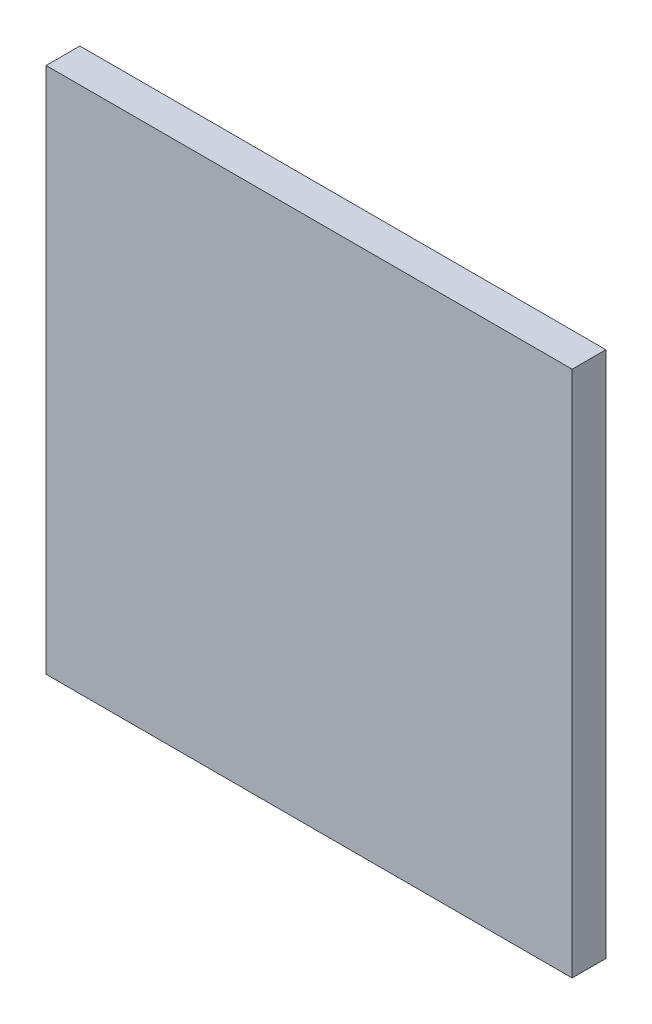
ISO-10303-21;
HEADER;
FILE_DESCRIPTION(('STEP AP214'),'2;1');
FILE_NAME('part.step','',(''),(''),'','','');
FILE_SCHEMA(('AUTOMOTIVE_DESIGN { 1 0 10303 214 1 1 1 1 }'));
ENDSEC;
DATA;
#1=APPLICATION_CONTEXT('core data for automotive mechanical design processes');
#2=APPLICATION_PROTOCOL_DEFINITION('international standard','automotive_design',2000,#1);
#3=PRODUCT_CONTEXT('',#1,'mechanical');
#4=PRODUCT('Part','Part','',(#3));
#5=PRODUCT_RELATED_PRODUCT_CATEGORY('part','',(#4));
#6=PRODUCT_DEFINITION_FORMATION('','',#4);
#7=PRODUCT_DEFINITION_CONTEXT('part definition',#1,'design');
#8=PRODUCT_DEFINITION('design','',#6,#7);
#9=PRODUCT_DEFINITION_SHAPE('','',#8);
#10=(LENGTH_UNIT() NAMED_UNIT(*) SI_UNIT(.MILLI.,.METRE.));
#11=(NAMED_UNIT(*) PLANE_ANGLE_UNIT() SI_UNIT($,.RADIAN.));
#12=(NAMED_UNIT(*) SI_UNIT($,.STERADIAN.) SOLID_ANGLE_UNIT());
#13=UNCERTAINTY_MEASURE_WITH_UNIT(LENGTH_MEASURE(1.E-05),#10,'distance_accuracy_value','');
#14=(GEOMETRIC_REPRESENTATION_CONTEXT(3) GLOBAL_UNCERTAINTY_ASSIGNED_CONTEXT((#13)) GLOBAL_UNIT_ASSIGNED_CONTEXT((#10,
#11,#12)) REPRESENTATION_CONTEXT('',''));
#15=CARTESIAN_POINT('',(0.,0.,0.));
#16=DIRECTION('',(0.,0.,1.));
#17=DIRECTION('',(1.,0.,0.));
#18=AXIS2_PLACEMENT_3D('',#15,#16,#17);
#19=CARTESIAN_POINT('',(62.3537454542026,-123.736,43.9999999999997));
#20=DIRECTION('',(-1.,0.,0.));
#21=DIRECTION('',(0.,-1.,0.));
#22=AXIS2_PLACEMENT_3D('',#19,#20,#21);
#23=PLANE('',#22);
#24=DIRECTION('',(0.,1.,0.));
#25=VECTOR('',#24,1.);
#26=CARTESIAN_POINT('',(62.3537454542026,-123.736,35.9999999999997));
#27=LINE('',#26,#25);
#28=CARTESIAN_POINT('',(62.3537454542026,-123.736,35.9999999999997));
#29=VERTEX_POINT('',#28);
#30=CARTESIAN_POINT('',(62.3537454542026,1.25599999999998,35.9999999999997));
#31=VERTEX_POINT('',#30);
#32=EDGE_CURVE('E93',#29,#31,#27,.T.);
#33=ORIENTED_EDGE('',*,*,#32,.T.);
#34=DIRECTION('',(0.,0.,-1.));
#35=VECTOR('',#34,1.);
#36=CARTESIAN_POINT('',(62.3537454542026,1.25599999999998,43.9999999999997));
#37=LINE('',#36,#35);
#38=CARTESIAN_POINT('',(62.3537454542026,1.25599999999998,43.9999999999997));
#39=VERTEX_POINT('',#38);
#40=EDGE_CURVE('E11',#39,#31,#37,.T.);
#41=ORIENTED_EDGE('',*,*,#40,.F.);
#42=DIRECTION('',(0.,1.,0.));
#43=VECTOR('',#42,1.);
#44=CARTESIAN_POINT('',(62.3537454542026,-123.736,43.9999999999997));
#45=LINE('',#44,#43);
#46=CARTESIAN_POINT('',(62.3537454542026,-123.736,43.9999999999997));
#47=VERTEX_POINT('',#46);
#48=EDGE_CURVE('E81',#47,#39,#45,.T.);
#49=ORIENTED_EDGE('',*,*,#48,.F.);
#50=DIRECTION('',(0.,0.,-1.));
#51=VECTOR('',#50,1.);
#52=CARTESIAN_POINT('',(62.3537454542026,-123.736,43.9999999999997));
#53=LINE('',#52,#51);
#54=EDGE_CURVE('E89',#47,#29,#53,.T.);
#55=ORIENTED_EDGE('',*,*,#54,.T.);
#56=EDGE_LOOP('',(#33,#41,#49,#55));
#57=FACE_BOUND('',#56,.T.);
#58=ADVANCED_FACE('F30',(#57),#23,.F.);
#59=CARTESIAN_POINT('',(-62.3537454544398,1.25599999999995,43.9999999999997));
#60=DIRECTION('',(0.,-1.,0.));
#61=DIRECTION('',(1.,0.,0.));
#62=AXIS2_PLACEMENT_3D('',#59,#60,#61);
#63=PLANE('',#62);
#64=DIRECTION('',(-1.,0.,0.));
#65=VECTOR('',#64,1.);
#66=CARTESIAN_POINT('',(-62.3537454544398,1.25599999999995,35.9999999999997));
#67=LINE('',#66,#65);
#68=CARTESIAN_POINT('',(-62.3537454544398,1.25599999999995,35.9999999999997));
#69=VERTEX_POINT('',#68);
#70=EDGE_CURVE('E85',#31,#69,#67,.T.);
#71=ORIENTED_EDGE('',*,*,#70,.T.);
#72=DIRECTION('',(0.,0.,-1.));
#73=VECTOR('',#72,1.);
#74=CARTESIAN_POINT('',(-62.3537454544398,1.25599999999995,43.9999999999997));
#75=LINE('',#74,#73);
#76=CARTESIAN_POINT('',(-62.3537454544398,1.25599999999995,43.9999999999997));
#77=VERTEX_POINT('',#76);
#78=EDGE_CURVE('E38',#77,#69,#75,.T.);
#79=ORIENTED_EDGE('',*,*,#78,.F.);
#80=DIRECTION('',(-1.,0.,0.));
#81=VECTOR('',#80,1.);
#82=CARTESIAN_POINT('',(-62.3537454544398,1.25599999999995,43.9999999999997));
#83=LINE('',#82,#81);
#84=EDGE_CURVE('E76',#39,#77,#83,.T.);
#85=ORIENTED_EDGE('',*,*,#84,.F.);
#86=ORIENTED_EDGE('',*,*,#40,.T.);
#87=EDGE_LOOP('',(#71,#79,#85,#86));
#88=FACE_BOUND('',#87,.T.);
#89=ADVANCED_FACE('F84',(#88),#63,.F.);
#90=CARTESIAN_POINT('',(-62.3537454544398,1.25599999999995,43.9999999999997));
#91=DIRECTION('',(1.,-8.41325341731583E-13,0.));
#92=DIRECTION('',(8.41325341731583E-13,1.,0.));
#93=AXIS2_PLACEMENT_3D('',#90,#91,#92);
#94=PLANE('',#93);
#95=DIRECTION('',(-8.41325341731583E-13,-1.,0.));
#96=VECTOR('',#95,1.);
#97=CARTESIAN_POINT('',(-62.3537454544398,1.25599999999995,35.9999999999997));
#98=LINE('',#97,#96);
#99=CARTESIAN_POINT('',(-62.3537454545449,-123.736,35.9999999999997));
#100=VERTEX_POINT('',#99);
#101=EDGE_CURVE('E63',#69,#100,#98,.T.);
#102=ORIENTED_EDGE('',*,*,#101,.T.);
#103=DIRECTION('',(0.,0.,-1.));
#104=VECTOR('',#103,1.);
#105=CARTESIAN_POINT('',(-62.3537454545449,-123.736,43.9999999999997));
#106=LINE('',#105,#104);
#107=CARTESIAN_POINT('',(-62.3537454545449,-123.736,43.9999999999997));
#108=VERTEX_POINT('',#107);
#109=EDGE_CURVE('E86',#108,#100,#106,.T.);
#110=ORIENTED_EDGE('',*,*,#109,.F.);
#111=DIRECTION('',(-8.41325341731583E-13,-1.,0.));
#112=VECTOR('',#111,1.);
#113=CARTESIAN_POINT('',(-62.3537454544398,1.25599999999995,43.9999999999997));
#114=LINE('',#113,#112);
#115=EDGE_CURVE('E79',#77,#108,#114,.T.);
#116=ORIENTED_EDGE('',*,*,#115,.F.);
#117=ORIENTED_EDGE('',*,*,#78,.T.);
#118=EDGE_LOOP('',(#102,#110,#116,#117));
#119=FACE_BOUND('',#118,.T.);
#120=ADVANCED_FACE('F87',(#119),#94,.F.);
#121=CARTESIAN_POINT('',(-62.3537454545449,-123.736,43.9999999999997));
#122=DIRECTION('',(0.,1.,0.));
#123=DIRECTION('',(-1.,0.,0.));
#124=AXIS2_PLACEMENT_3D('',#121,#122,#123);
#125=PLANE('',#124);
#126=DIRECTION('',(1.,0.,0.));
#127=VECTOR('',#126,1.);
#128=CARTESIAN_POINT('',(-62.3537454545449,-123.736,35.9999999999997));
#129=LINE('',#128,#127);
#130=EDGE_CURVE('E69',#100,#29,#129,.T.);
#131=ORIENTED_EDGE('',*,*,#130,.T.);
#132=ORIENTED_EDGE('',*,*,#54,.F.);
#133=DIRECTION('',(1.,0.,0.));
#134=VECTOR('',#133,1.);
#135=CARTESIAN_POINT('',(-62.3537454545449,-123.736,43.9999999999997));
#136=LINE('',#135,#134);
#137=EDGE_CURVE('E46',#108,#47,#136,.T.);
#138=ORIENTED_EDGE('',*,*,#137,.F.);
#139=ORIENTED_EDGE('',*,*,#109,.T.);
#140=EDGE_LOOP('',(#131,#132,#138,#139));
#141=FACE_BOUND('',#140,.T.);
#142=ADVANCED_FACE('F100',(#141),#125,.F.);
#143=CARTESIAN_POINT('',(62.3537454542025,1.25599999999998,43.9999999999997));
#144=DIRECTION('',(0.,0.,-1.));
#145=DIRECTION('',(-1.,0.,0.));
#146=AXIS2_PLACEMENT_3D('',#143,#144,#145);
#147=PLANE('',#146);
#148=ORIENTED_EDGE('',*,*,#48,.T.);
#149=ORIENTED_EDGE('',*,*,#84,.T.);
#150=ORIENTED_EDGE('',*,*,#115,.T.);
#151=ORIENTED_EDGE('',*,*,#137,.T.);
#152=EDGE_LOOP('',(#148,#149,#150,#151));
#153=FACE_BOUND('',#152,.T.);
#154=ADVANCED_FACE('F77',(#153),#147,.F.);
#155=CARTESIAN_POINT('',(62.3537454542025,1.25599999999998,35.9999999999997));
#156=DIRECTION('',(0.,0.,-1.));
#157=DIRECTION('',(-1.,0.,0.));
#158=AXIS2_PLACEMENT_3D('',#155,#156,#157);
#159=PLANE('',#158);
#160=ORIENTED_EDGE('',*,*,#32,.F.);
#161=ORIENTED_EDGE('',*,*,#130,.F.);
#162=ORIENTED_EDGE('',*,*,#101,.F.);
#163=ORIENTED_EDGE('',*,*,#70,.F.);
#164=EDGE_LOOP('',(#160,#161,#162,#163));
#165=FACE_BOUND('',#164,.T.);
#166=ADVANCED_FACE('F103',(#165),#159,.T.);
#167=CLOSED_SHELL('',(#58,#89,#120,#142,#154,#166));
#168=MANIFOLD_SOLID_BREP('B2',#167);
#169=ADVANCED_BREP_SHAPE_REPRESENTATION('',(#18,#168),#14);
#170=SHAPE_DEFINITION_REPRESENTATION(#9,#169);
ENDSEC;
END-ISO-10303-21;
